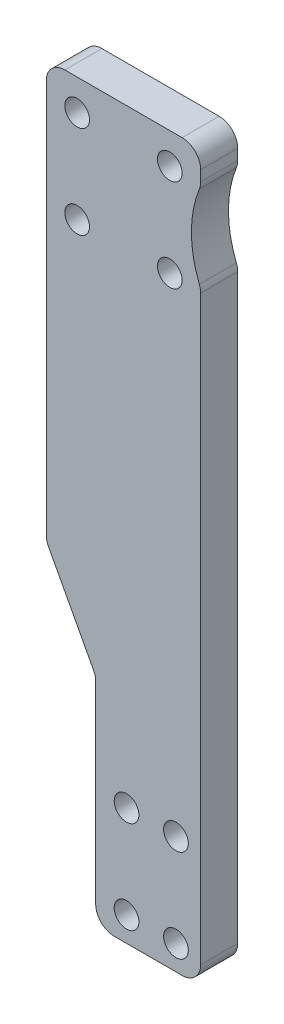
ISO-10303-21;
HEADER;
FILE_DESCRIPTION(('STEP AP214'),'2;1');
FILE_NAME('part.step','',(''),(''),'','','');
FILE_SCHEMA(('AUTOMOTIVE_DESIGN { 1 0 10303 214 1 1 1 1 }'));
ENDSEC;
DATA;
#1=APPLICATION_CONTEXT('core data for automotive mechanical design processes');
#2=APPLICATION_PROTOCOL_DEFINITION('international standard','automotive_design',2000,#1);
#3=PRODUCT_CONTEXT('',#1,'mechanical');
#4=PRODUCT('Part','Part','',(#3));
#5=PRODUCT_RELATED_PRODUCT_CATEGORY('part','',(#4));
#6=PRODUCT_DEFINITION_FORMATION('','',#4);
#7=PRODUCT_DEFINITION_CONTEXT('part definition',#1,'design');
#8=PRODUCT_DEFINITION('design','',#6,#7);
#9=PRODUCT_DEFINITION_SHAPE('','',#8);
#10=(LENGTH_UNIT() NAMED_UNIT(*) SI_UNIT(.MILLI.,.METRE.));
#11=(NAMED_UNIT(*) PLANE_ANGLE_UNIT() SI_UNIT($,.RADIAN.));
#12=(NAMED_UNIT(*) SI_UNIT($,.STERADIAN.) SOLID_ANGLE_UNIT());
#13=UNCERTAINTY_MEASURE_WITH_UNIT(LENGTH_MEASURE(1.E-05),#10,'distance_accuracy_value','');
#14=(GEOMETRIC_REPRESENTATION_CONTEXT(3) GLOBAL_UNCERTAINTY_ASSIGNED_CONTEXT((#13)) GLOBAL_UNIT_ASSIGNED_CONTEXT((#10,
#11,#12)) REPRESENTATION_CONTEXT('',''));
#15=CARTESIAN_POINT('',(0.,0.,0.));
#16=DIRECTION('',(0.,0.,1.));
#17=DIRECTION('',(1.,0.,0.));
#18=AXIS2_PLACEMENT_3D('',#15,#16,#17);
#19=CARTESIAN_POINT('',(0.,0.,6.));
#20=DIRECTION('',(0.,0.,1.));
#21=DIRECTION('',(1.,0.,0.));
#22=AXIS2_PLACEMENT_3D('',#19,#20,#21);
#23=PLANE('',#22);
#24=DIRECTION('',(0.,1.,0.));
#25=VECTOR('',#24,1.);
#26=CARTESIAN_POINT('',(0.999999999999982,30.,6.));
#27=LINE('',#26,#25);
#28=CARTESIAN_POINT('',(0.999999999999986,-1.99999999999999,6.));
#29=VERTEX_POINT('',#28);
#30=CARTESIAN_POINT('',(0.999999999999982,29.25,6.));
#31=VERTEX_POINT('',#30);
#32=EDGE_CURVE('E484',#29,#31,#27,.T.);
#33=ORIENTED_EDGE('',*,*,#32,.F.);
#34=CARTESIAN_POINT('',(3.99999999999999,-1.99999999999999,6.));
#35=DIRECTION('',(0.,0.,1.));
#36=DIRECTION('',(1.,0.,0.));
#37=AXIS2_PLACEMENT_3D('',#34,#35,#36);
#38=CIRCLE('',#37,3.);
#39=CARTESIAN_POINT('',(3.99999999999999,-5.,6.));
#40=VERTEX_POINT('',#39);
#41=EDGE_CURVE('E298',#29,#40,#38,.T.);
#42=ORIENTED_EDGE('',*,*,#41,.T.);
#43=DIRECTION('',(1.,0.,0.));
#44=VECTOR('',#43,1.);
#45=CARTESIAN_POINT('',(0.,-5.,6.));
#46=LINE('',#45,#44);
#47=CARTESIAN_POINT('',(15.,-5.,6.));
#48=VERTEX_POINT('',#47);
#49=EDGE_CURVE('E244',#40,#48,#46,.T.);
#50=ORIENTED_EDGE('',*,*,#49,.T.);
#51=CARTESIAN_POINT('',(15.,-2.,6.));
#52=DIRECTION('',(0.,0.,1.));
#53=DIRECTION('',(1.,0.,0.));
#54=AXIS2_PLACEMENT_3D('',#51,#52,#53);
#55=CIRCLE('',#54,3.);
#56=CARTESIAN_POINT('',(18.,-1.99999999999999,6.));
#57=VERTEX_POINT('',#56);
#58=EDGE_CURVE('E258',#48,#57,#55,.T.);
#59=ORIENTED_EDGE('',*,*,#58,.T.);
#60=DIRECTION('',(0.,-1.,0.));
#61=VECTOR('',#60,1.);
#62=CARTESIAN_POINT('',(18.,0.,6.));
#63=LINE('',#62,#61);
#64=CARTESIAN_POINT('',(18.,92.20577136594,6.));
#65=VERTEX_POINT('',#64);
#66=EDGE_CURVE('E235',#65,#57,#63,.T.);
#67=ORIENTED_EDGE('',*,*,#66,.F.);
#68=CARTESIAN_POINT('',(15.,92.20577136594,6.));
#69=DIRECTION('',(0.,0.,1.));
#70=DIRECTION('',(1.,0.,0.));
#71=AXIS2_PLACEMENT_3D('',#68,#69,#70);
#72=CIRCLE('',#71,3.);
#73=CARTESIAN_POINT('',(17.7857142857143,93.3192325993771,6.));
#74=VERTEX_POINT('',#73);
#75=EDGE_CURVE('E260',#65,#74,#72,.T.);
#76=ORIENTED_EDGE('',*,*,#75,.T.);
#77=CARTESIAN_POINT('',(34.5,100.,6.));
#78=DIRECTION('',(0.,0.,1.));
#79=DIRECTION('',(1.,0.,0.));
#80=AXIS2_PLACEMENT_3D('',#77,#78,#79);
#81=CIRCLE('',#80,18.);
#82=CARTESIAN_POINT('',(17.7857142857143,106.680767400623,6.));
#83=VERTEX_POINT('',#82);
#84=EDGE_CURVE('E458',#83,#74,#81,.T.);
#85=ORIENTED_EDGE('',*,*,#84,.F.);
#86=CARTESIAN_POINT('',(15.,107.79422863406,6.));
#87=DIRECTION('',(0.,0.,1.));
#88=DIRECTION('',(1.,0.,0.));
#89=AXIS2_PLACEMENT_3D('',#86,#87,#88);
#90=CIRCLE('',#89,3.);
#91=CARTESIAN_POINT('',(18.,107.79422863406,6.));
#92=VERTEX_POINT('',#91);
#93=EDGE_CURVE('E262',#83,#92,#90,.T.);
#94=ORIENTED_EDGE('',*,*,#93,.T.);
#95=CARTESIAN_POINT('',(18.,109.5,6.));
#96=VERTEX_POINT('',#95);
#97=EDGE_CURVE('E441',#96,#92,#63,.T.);
#98=ORIENTED_EDGE('',*,*,#97,.F.);
#99=CARTESIAN_POINT('',(15.,109.5,6.));
#100=DIRECTION('',(0.,0.,1.));
#101=DIRECTION('',(1.,0.,0.));
#102=AXIS2_PLACEMENT_3D('',#99,#100,#101);
#103=CIRCLE('',#102,3.);
#104=CARTESIAN_POINT('',(15.,112.5,6.));
#105=VERTEX_POINT('',#104);
#106=EDGE_CURVE('E256',#96,#105,#103,.T.);
#107=ORIENTED_EDGE('',*,*,#106,.T.);
#108=DIRECTION('',(1.,0.,0.));
#109=VECTOR('',#108,1.);
#110=CARTESIAN_POINT('',(0.,112.5,6.));
#111=LINE('',#110,#109);
#112=CARTESIAN_POINT('',(-4.00000000000001,112.5,6.));
#113=VERTEX_POINT('',#112);
#114=EDGE_CURVE('E435',#113,#105,#111,.T.);
#115=ORIENTED_EDGE('',*,*,#114,.F.);
#116=CARTESIAN_POINT('',(-4.00000000000001,109.5,6.));
#117=DIRECTION('',(0.,0.,1.));
#118=DIRECTION('',(1.,0.,0.));
#119=AXIS2_PLACEMENT_3D('',#116,#117,#118);
#120=CIRCLE('',#119,3.);
#121=CARTESIAN_POINT('',(-7.00000000000001,109.5,6.));
#122=VERTEX_POINT('',#121);
#123=EDGE_CURVE('E264',#113,#122,#120,.T.);
#124=ORIENTED_EDGE('',*,*,#123,.T.);
#125=DIRECTION('',(0.,-1.,0.));
#126=VECTOR('',#125,1.);
#127=CARTESIAN_POINT('',(-7.,0.,6.));
#128=LINE('',#127,#126);
#129=CARTESIAN_POINT('',(-7.,45.75,6.));
#130=VERTEX_POINT('',#129);
#131=EDGE_CURVE('E216',#122,#130,#128,.T.);
#132=ORIENTED_EDGE('',*,*,#131,.T.);
#133=CARTESIAN_POINT('',(-4.,45.75,6.));
#134=DIRECTION('',(0.,0.,1.));
#135=DIRECTION('',(1.,0.,0.));
#136=AXIS2_PLACEMENT_3D('',#133,#134,#135);
#137=CIRCLE('',#136,3.);
#138=CARTESIAN_POINT('',(-6.64705882352942,44.3382352941176,6.));
#139=VERTEX_POINT('',#138);
#140=EDGE_CURVE('E296',#130,#139,#137,.T.);
#141=ORIENTED_EDGE('',*,*,#140,.T.);
#142=DIRECTION('',(-0.470588235294117,0.882352941176471,0.));
#143=VECTOR('',#142,1.);
#144=CARTESIAN_POINT('',(-7.00000000000001,45.,6.));
#145=LINE('',#144,#143);
#146=CARTESIAN_POINT('',(0.647058823529396,30.6617647058824,6.));
#147=VERTEX_POINT('',#146);
#148=EDGE_CURVE('E492',#147,#139,#145,.T.);
#149=ORIENTED_EDGE('',*,*,#148,.F.);
#150=CARTESIAN_POINT('',(-2.00000000000002,29.25,6.));
#151=DIRECTION('',(0.,0.,1.));
#152=DIRECTION('',(1.,0.,0.));
#153=AXIS2_PLACEMENT_3D('',#150,#151,#152);
#154=CIRCLE('',#153,3.);
#155=EDGE_CURVE('E311',#147,#31,#154,.F.);
#156=ORIENTED_EDGE('',*,*,#155,.T.);
#157=EDGE_LOOP('',(#33,#42,#50,#59,#67,#76,#85,#94,#98,#107,#115,#124,#132,#141,#149,#156));
#158=FACE_BOUND('',#157,.T.);
#159=CARTESIAN_POINT('',(14.,14.,6.));
#160=DIRECTION('',(0.,0.,1.));
#161=DIRECTION('',(1.,0.,0.));
#162=AXIS2_PLACEMENT_3D('',#159,#160,#161);
#163=CIRCLE('',#162,2.);
#164=CARTESIAN_POINT('',(16.,14.,6.));
#165=VERTEX_POINT('',#164);
#166=EDGE_CURVE('E288',#165,#165,#163,.T.);
#167=ORIENTED_EDGE('',*,*,#166,.F.);
#168=EDGE_LOOP('',(#167));
#169=FACE_BOUND('',#168,.T.);
#170=CARTESIAN_POINT('',(14.,-0.999999999999995,6.));
#171=DIRECTION('',(0.,0.,1.));
#172=DIRECTION('',(1.,0.,0.));
#173=AXIS2_PLACEMENT_3D('',#170,#171,#172);
#174=CIRCLE('',#173,2.);
#175=CARTESIAN_POINT('',(16.,-0.999999999999995,6.));
#176=VERTEX_POINT('',#175);
#177=EDGE_CURVE('E490',#176,#176,#174,.T.);
#178=ORIENTED_EDGE('',*,*,#177,.F.);
#179=EDGE_LOOP('',(#178));
#180=FACE_BOUND('',#179,.T.);
#181=CARTESIAN_POINT('',(5.99999999999999,14.,6.));
#182=DIRECTION('',(0.,0.,1.));
#183=DIRECTION('',(1.,0.,0.));
#184=AXIS2_PLACEMENT_3D('',#181,#182,#183);
#185=CIRCLE('',#184,2.);
#186=CARTESIAN_POINT('',(7.99999999999999,14.,6.));
#187=VERTEX_POINT('',#186);
#188=EDGE_CURVE('E291',#187,#187,#185,.T.);
#189=ORIENTED_EDGE('',*,*,#188,.F.);
#190=EDGE_LOOP('',(#189));
#191=FACE_BOUND('',#190,.T.);
#192=CARTESIAN_POINT('',(5.99999999999999,-0.999999999999996,6.));
#193=DIRECTION('',(0.,0.,1.));
#194=DIRECTION('',(1.,0.,0.));
#195=AXIS2_PLACEMENT_3D('',#192,#193,#194);
#196=CIRCLE('',#195,2.);
#197=CARTESIAN_POINT('',(7.99999999999999,-0.999999999999996,6.));
#198=VERTEX_POINT('',#197);
#199=EDGE_CURVE('E242',#198,#198,#196,.T.);
#200=ORIENTED_EDGE('',*,*,#199,.F.);
#201=EDGE_LOOP('',(#200));
#202=FACE_BOUND('',#201,.T.);
#203=CARTESIAN_POINT('',(13.,107.5,6.));
#204=DIRECTION('',(0.,0.,1.));
#205=DIRECTION('',(1.,0.,0.));
#206=AXIS2_PLACEMENT_3D('',#203,#204,#205);
#207=CIRCLE('',#206,2.00000000000001);
#208=CARTESIAN_POINT('',(15.,107.5,6.));
#209=VERTEX_POINT('',#208);
#210=EDGE_CURVE('E434',#209,#209,#207,.T.);
#211=ORIENTED_EDGE('',*,*,#210,.F.);
#212=EDGE_LOOP('',(#211));
#213=FACE_BOUND('',#212,.T.);
#214=CARTESIAN_POINT('',(13.,92.5,6.));
#215=DIRECTION('',(0.,0.,1.));
#216=DIRECTION('',(1.,0.,0.));
#217=AXIS2_PLACEMENT_3D('',#214,#215,#216);
#218=CIRCLE('',#217,2.00000000000001);
#219=CARTESIAN_POINT('',(15.,92.5,6.));
#220=VERTEX_POINT('',#219);
#221=EDGE_CURVE('E438',#220,#220,#218,.T.);
#222=ORIENTED_EDGE('',*,*,#221,.F.);
#223=EDGE_LOOP('',(#222));
#224=FACE_BOUND('',#223,.T.);
#225=CARTESIAN_POINT('',(-2.00000000000001,92.5,6.));
#226=DIRECTION('',(0.,0.,1.));
#227=DIRECTION('',(1.,0.,0.));
#228=AXIS2_PLACEMENT_3D('',#225,#226,#227);
#229=CIRCLE('',#228,2.00000000000001);
#230=CARTESIAN_POINT('',(0.,92.5,6.));
#231=VERTEX_POINT('',#230);
#232=EDGE_CURVE('E447',#231,#231,#229,.T.);
#233=ORIENTED_EDGE('',*,*,#232,.F.);
#234=EDGE_LOOP('',(#233));
#235=FACE_BOUND('',#234,.T.);
#236=CARTESIAN_POINT('',(-2.00000000000001,107.5,6.));
#237=DIRECTION('',(0.,0.,1.));
#238=DIRECTION('',(1.,0.,0.));
#239=AXIS2_PLACEMENT_3D('',#236,#237,#238);
#240=CIRCLE('',#239,2.00000000000001);
#241=CARTESIAN_POINT('',(0.,107.5,6.));
#242=VERTEX_POINT('',#241);
#243=EDGE_CURVE('E237',#242,#242,#240,.T.);
#244=ORIENTED_EDGE('',*,*,#243,.F.);
#245=EDGE_LOOP('',(#244));
#246=FACE_BOUND('',#245,.T.);
#247=ADVANCED_FACE('F81',(#158,#169,#180,#191,#202,#213,#224,#235,#246),#23,.T.);
#248=CARTESIAN_POINT('',(0.,0.,0.));
#249=DIRECTION('',(0.,0.,1.));
#250=DIRECTION('',(1.,0.,0.));
#251=AXIS2_PLACEMENT_3D('',#248,#249,#250);
#252=PLANE('',#251);
#253=CARTESIAN_POINT('',(-2.00000000000001,92.5,0.));
#254=DIRECTION('',(0.,0.,1.));
#255=DIRECTION('',(1.,0.,0.));
#256=AXIS2_PLACEMENT_3D('',#253,#254,#255);
#257=CIRCLE('',#256,3.99999999999999);
#258=CARTESIAN_POINT('',(1.99999999999998,92.5,0.));
#259=VERTEX_POINT('',#258);
#260=EDGE_CURVE('E318',#259,#259,#257,.T.);
#261=ORIENTED_EDGE('',*,*,#260,.T.);
#262=EDGE_LOOP('',(#261));
#263=FACE_BOUND('',#262,.T.);
#264=CARTESIAN_POINT('',(-2.00000000000001,107.5,0.));
#265=DIRECTION('',(0.,0.,1.));
#266=DIRECTION('',(1.,0.,0.));
#267=AXIS2_PLACEMENT_3D('',#264,#265,#266);
#268=CIRCLE('',#267,3.99999999999999);
#269=CARTESIAN_POINT('',(1.99999999999998,107.5,0.));
#270=VERTEX_POINT('',#269);
#271=EDGE_CURVE('E315',#270,#270,#268,.T.);
#272=ORIENTED_EDGE('',*,*,#271,.T.);
#273=EDGE_LOOP('',(#272));
#274=FACE_BOUND('',#273,.T.);
#275=CARTESIAN_POINT('',(14.,14.,0.));
#276=DIRECTION('',(0.,0.,1.));
#277=DIRECTION('',(1.,0.,0.));
#278=AXIS2_PLACEMENT_3D('',#275,#276,#277);
#279=CIRCLE('',#278,2.);
#280=CARTESIAN_POINT('',(16.,14.,0.));
#281=VERTEX_POINT('',#280);
#282=EDGE_CURVE('E287',#281,#281,#279,.T.);
#283=ORIENTED_EDGE('',*,*,#282,.T.);
#284=EDGE_LOOP('',(#283));
#285=FACE_BOUND('',#284,.T.);
#286=CARTESIAN_POINT('',(14.,-0.999999999999995,0.));
#287=DIRECTION('',(0.,0.,1.));
#288=DIRECTION('',(1.,0.,0.));
#289=AXIS2_PLACEMENT_3D('',#286,#287,#288);
#290=CIRCLE('',#289,2.);
#291=CARTESIAN_POINT('',(16.,-0.999999999999995,0.));
#292=VERTEX_POINT('',#291);
#293=EDGE_CURVE('E284',#292,#292,#290,.T.);
#294=ORIENTED_EDGE('',*,*,#293,.T.);
#295=EDGE_LOOP('',(#294));
#296=FACE_BOUND('',#295,.T.);
#297=CARTESIAN_POINT('',(5.99999999999999,14.,0.));
#298=DIRECTION('',(0.,0.,1.));
#299=DIRECTION('',(1.,0.,0.));
#300=AXIS2_PLACEMENT_3D('',#297,#298,#299);
#301=CIRCLE('',#300,2.);
#302=CARTESIAN_POINT('',(7.99999999999999,14.,0.));
#303=VERTEX_POINT('',#302);
#304=EDGE_CURVE('E241',#303,#303,#301,.T.);
#305=ORIENTED_EDGE('',*,*,#304,.T.);
#306=EDGE_LOOP('',(#305));
#307=FACE_BOUND('',#306,.T.);
#308=CARTESIAN_POINT('',(5.99999999999999,-0.999999999999996,0.));
#309=DIRECTION('',(0.,0.,1.));
#310=DIRECTION('',(1.,0.,0.));
#311=AXIS2_PLACEMENT_3D('',#308,#309,#310);
#312=CIRCLE('',#311,2.);
#313=CARTESIAN_POINT('',(7.99999999999999,-0.999999999999996,0.));
#314=VERTEX_POINT('',#313);
#315=EDGE_CURVE('E238',#314,#314,#312,.T.);
#316=ORIENTED_EDGE('',*,*,#315,.T.);
#317=EDGE_LOOP('',(#316));
#318=FACE_BOUND('',#317,.T.);
#319=DIRECTION('',(1.,0.,0.));
#320=VECTOR('',#319,1.);
#321=CARTESIAN_POINT('',(0.,-5.,0.));
#322=LINE('',#321,#320);
#323=CARTESIAN_POINT('',(3.99999999999999,-5.,0.));
#324=VERTEX_POINT('',#323);
#325=CARTESIAN_POINT('',(15.,-5.,0.));
#326=VERTEX_POINT('',#325);
#327=EDGE_CURVE('E218',#324,#326,#322,.T.);
#328=ORIENTED_EDGE('',*,*,#327,.F.);
#329=CARTESIAN_POINT('',(3.99999999999999,-1.99999999999999,0.));
#330=DIRECTION('',(0.,0.,1.));
#331=DIRECTION('',(1.,0.,0.));
#332=AXIS2_PLACEMENT_3D('',#329,#330,#331);
#333=CIRCLE('',#332,3.);
#334=CARTESIAN_POINT('',(0.999999999999986,-2.,0.));
#335=VERTEX_POINT('',#334);
#336=EDGE_CURVE('E303',#324,#335,#333,.F.);
#337=ORIENTED_EDGE('',*,*,#336,.T.);
#338=DIRECTION('',(0.,1.,0.));
#339=VECTOR('',#338,1.);
#340=CARTESIAN_POINT('',(0.999999999999985,0.,0.));
#341=LINE('',#340,#339);
#342=CARTESIAN_POINT('',(0.999999999999982,29.25,0.));
#343=VERTEX_POINT('',#342);
#344=EDGE_CURVE('E486',#335,#343,#341,.T.);
#345=ORIENTED_EDGE('',*,*,#344,.T.);
#346=CARTESIAN_POINT('',(-2.00000000000002,29.25,0.));
#347=DIRECTION('',(0.,0.,1.));
#348=DIRECTION('',(1.,0.,0.));
#349=AXIS2_PLACEMENT_3D('',#346,#347,#348);
#350=CIRCLE('',#349,3.);
#351=CARTESIAN_POINT('',(0.647058823529395,30.6617647058824,0.));
#352=VERTEX_POINT('',#351);
#353=EDGE_CURVE('E313',#343,#352,#350,.T.);
#354=ORIENTED_EDGE('',*,*,#353,.T.);
#355=DIRECTION('',(-0.470588235294117,0.882352941176471,0.));
#356=VECTOR('',#355,1.);
#357=CARTESIAN_POINT('',(13.235294117647,7.05882352941175,0.));
#358=LINE('',#357,#356);
#359=CARTESIAN_POINT('',(-6.64705882352942,44.3382352941176,0.));
#360=VERTEX_POINT('',#359);
#361=EDGE_CURVE('E488',#352,#360,#358,.T.);
#362=ORIENTED_EDGE('',*,*,#361,.T.);
#363=CARTESIAN_POINT('',(-4.,45.75,0.));
#364=DIRECTION('',(0.,0.,1.));
#365=DIRECTION('',(1.,0.,0.));
#366=AXIS2_PLACEMENT_3D('',#363,#364,#365);
#367=CIRCLE('',#366,3.);
#368=CARTESIAN_POINT('',(-7.,45.75,0.));
#369=VERTEX_POINT('',#368);
#370=EDGE_CURVE('E97',#360,#369,#367,.F.);
#371=ORIENTED_EDGE('',*,*,#370,.T.);
#372=DIRECTION('',(0.,-1.,0.));
#373=VECTOR('',#372,1.);
#374=CARTESIAN_POINT('',(-7.,0.,0.));
#375=LINE('',#374,#373);
#376=CARTESIAN_POINT('',(-7.00000000000001,109.5,0.));
#377=VERTEX_POINT('',#376);
#378=EDGE_CURVE('E213',#377,#369,#375,.T.);
#379=ORIENTED_EDGE('',*,*,#378,.F.);
#380=CARTESIAN_POINT('',(-4.00000000000001,109.5,0.));
#381=DIRECTION('',(0.,0.,1.));
#382=DIRECTION('',(1.,0.,0.));
#383=AXIS2_PLACEMENT_3D('',#380,#381,#382);
#384=CIRCLE('',#383,3.);
#385=CARTESIAN_POINT('',(-4.00000000000001,112.5,0.));
#386=VERTEX_POINT('',#385);
#387=EDGE_CURVE('E198',#377,#386,#384,.F.);
#388=ORIENTED_EDGE('',*,*,#387,.T.);
#389=DIRECTION('',(1.,0.,0.));
#390=VECTOR('',#389,1.);
#391=CARTESIAN_POINT('',(0.,112.5,0.));
#392=LINE('',#391,#390);
#393=CARTESIAN_POINT('',(15.,112.5,0.));
#394=VERTEX_POINT('',#393);
#395=EDGE_CURVE('E224',#386,#394,#392,.T.);
#396=ORIENTED_EDGE('',*,*,#395,.T.);
#397=CARTESIAN_POINT('',(15.,109.5,0.));
#398=DIRECTION('',(0.,0.,1.));
#399=DIRECTION('',(1.,0.,0.));
#400=AXIS2_PLACEMENT_3D('',#397,#398,#399);
#401=CIRCLE('',#400,3.);
#402=CARTESIAN_POINT('',(18.,109.5,0.));
#403=VERTEX_POINT('',#402);
#404=EDGE_CURVE('E217',#394,#403,#401,.F.);
#405=ORIENTED_EDGE('',*,*,#404,.T.);
#406=DIRECTION('',(0.,-1.,0.));
#407=VECTOR('',#406,1.);
#408=CARTESIAN_POINT('',(18.,0.,0.));
#409=LINE('',#408,#407);
#410=CARTESIAN_POINT('',(18.,107.79422863406,0.));
#411=VERTEX_POINT('',#410);
#412=EDGE_CURVE('E229',#403,#411,#409,.T.);
#413=ORIENTED_EDGE('',*,*,#412,.T.);
#414=CARTESIAN_POINT('',(15.,107.79422863406,0.));
#415=DIRECTION('',(0.,0.,1.));
#416=DIRECTION('',(1.,0.,0.));
#417=AXIS2_PLACEMENT_3D('',#414,#415,#416);
#418=CIRCLE('',#417,3.);
#419=CARTESIAN_POINT('',(17.7857142857143,106.680767400623,0.));
#420=VERTEX_POINT('',#419);
#421=EDGE_CURVE('E207',#411,#420,#418,.F.);
#422=ORIENTED_EDGE('',*,*,#421,.T.);
#423=CARTESIAN_POINT('',(34.5,100.,0.));
#424=DIRECTION('',(0.,0.,1.));
#425=DIRECTION('',(1.,0.,0.));
#426=AXIS2_PLACEMENT_3D('',#423,#424,#425);
#427=CIRCLE('',#426,18.);
#428=CARTESIAN_POINT('',(17.7857142857143,93.3192325993771,0.));
#429=VERTEX_POINT('',#428);
#430=EDGE_CURVE('E453',#420,#429,#427,.T.);
#431=ORIENTED_EDGE('',*,*,#430,.T.);
#432=CARTESIAN_POINT('',(15.,92.20577136594,0.));
#433=DIRECTION('',(0.,0.,1.));
#434=DIRECTION('',(1.,0.,0.));
#435=AXIS2_PLACEMENT_3D('',#432,#433,#434);
#436=CIRCLE('',#435,3.);
#437=CARTESIAN_POINT('',(18.,92.20577136594,0.));
#438=VERTEX_POINT('',#437);
#439=EDGE_CURVE('E250',#429,#438,#436,.F.);
#440=ORIENTED_EDGE('',*,*,#439,.T.);
#441=CARTESIAN_POINT('',(18.,-1.99999999999999,0.));
#442=VERTEX_POINT('',#441);
#443=EDGE_CURVE('E451',#438,#442,#409,.T.);
#444=ORIENTED_EDGE('',*,*,#443,.T.);
#445=CARTESIAN_POINT('',(15.,-2.,0.));
#446=DIRECTION('',(0.,0.,1.));
#447=DIRECTION('',(1.,0.,0.));
#448=AXIS2_PLACEMENT_3D('',#445,#446,#447);
#449=CIRCLE('',#448,3.);
#450=EDGE_CURVE('E247',#442,#326,#449,.F.);
#451=ORIENTED_EDGE('',*,*,#450,.T.);
#452=EDGE_LOOP('',(#328,#337,#345,#354,#362,#371,#379,#388,#396,#405,#413,#422,#431,#440,#444,#451));
#453=FACE_BOUND('',#452,.T.);
#454=CARTESIAN_POINT('',(13.,107.5,0.));
#455=DIRECTION('',(0.,0.,1.));
#456=DIRECTION('',(1.,0.,0.));
#457=AXIS2_PLACEMENT_3D('',#454,#455,#456);
#458=CIRCLE('',#457,2.00000000000001);
#459=CARTESIAN_POINT('',(15.,107.5,0.));
#460=VERTEX_POINT('',#459);
#461=EDGE_CURVE('E223',#460,#460,#458,.T.);
#462=ORIENTED_EDGE('',*,*,#461,.T.);
#463=EDGE_LOOP('',(#462));
#464=FACE_BOUND('',#463,.T.);
#465=CARTESIAN_POINT('',(13.,92.5,0.));
#466=DIRECTION('',(0.,0.,1.));
#467=DIRECTION('',(1.,0.,0.));
#468=AXIS2_PLACEMENT_3D('',#465,#466,#467);
#469=CIRCLE('',#468,2.00000000000001);
#470=CARTESIAN_POINT('',(15.,92.5,0.));
#471=VERTEX_POINT('',#470);
#472=EDGE_CURVE('E227',#471,#471,#469,.T.);
#473=ORIENTED_EDGE('',*,*,#472,.T.);
#474=EDGE_LOOP('',(#473));
#475=FACE_BOUND('',#474,.T.);
#476=ADVANCED_FACE('F221',(#263,#274,#285,#296,#307,#318,#453,#464,#475),#252,.F.);
#477=CARTESIAN_POINT('',(18.,0.,6.));
#478=DIRECTION('',(1.,0.,0.));
#479=DIRECTION('',(0.,1.,0.));
#480=AXIS2_PLACEMENT_3D('',#477,#478,#479);
#481=PLANE('',#480);
#482=ORIENTED_EDGE('',*,*,#97,.T.);
#483=DIRECTION('',(0.,0.,-1.));
#484=VECTOR('',#483,1.);
#485=CARTESIAN_POINT('',(18.,107.79422863406,0.));
#486=LINE('',#485,#484);
#487=EDGE_CURVE('E274',#92,#411,#486,.T.);
#488=ORIENTED_EDGE('',*,*,#487,.T.);
#489=ORIENTED_EDGE('',*,*,#412,.F.);
#490=DIRECTION('',(0.,0.,-1.));
#491=VECTOR('',#490,1.);
#492=CARTESIAN_POINT('',(18.,109.5,6.));
#493=LINE('',#492,#491);
#494=EDGE_CURVE('E272',#403,#96,#493,.F.);
#495=ORIENTED_EDGE('',*,*,#494,.T.);
#496=EDGE_LOOP('',(#482,#488,#489,#495));
#497=FACE_BOUND('',#496,.T.);
#498=ADVANCED_FACE('F334',(#497),#481,.T.);
#499=ORIENTED_EDGE('',*,*,#443,.F.);
#500=DIRECTION('',(0.,0.,-1.));
#501=VECTOR('',#500,1.);
#502=CARTESIAN_POINT('',(18.,92.20577136594,6.));
#503=LINE('',#502,#501);
#504=EDGE_CURVE('E278',#438,#65,#503,.F.);
#505=ORIENTED_EDGE('',*,*,#504,.T.);
#506=ORIENTED_EDGE('',*,*,#66,.T.);
#507=DIRECTION('',(0.,0.,1.));
#508=VECTOR('',#507,1.);
#509=CARTESIAN_POINT('',(18.,-1.99999999999999,6.));
#510=LINE('',#509,#508);
#511=EDGE_CURVE('E276',#57,#442,#510,.F.);
#512=ORIENTED_EDGE('',*,*,#511,.T.);
#513=EDGE_LOOP('',(#499,#505,#506,#512));
#514=FACE_BOUND('',#513,.T.);
#515=ADVANCED_FACE('F390',(#514),#481,.T.);
#516=CARTESIAN_POINT('',(0.,112.5,6.));
#517=DIRECTION('',(0.,1.,0.));
#518=DIRECTION('',(-1.,0.,0.));
#519=AXIS2_PLACEMENT_3D('',#516,#517,#518);
#520=PLANE('',#519);
#521=ORIENTED_EDGE('',*,*,#395,.F.);
#522=DIRECTION('',(0.,0.,-1.));
#523=VECTOR('',#522,1.);
#524=CARTESIAN_POINT('',(-4.00000000000001,112.5,6.));
#525=LINE('',#524,#523);
#526=EDGE_CURVE('E203',#386,#113,#525,.F.);
#527=ORIENTED_EDGE('',*,*,#526,.T.);
#528=ORIENTED_EDGE('',*,*,#114,.T.);
#529=DIRECTION('',(0.,0.,-1.));
#530=VECTOR('',#529,1.);
#531=CARTESIAN_POINT('',(15.,112.5,6.));
#532=LINE('',#531,#530);
#533=EDGE_CURVE('E206',#105,#394,#532,.T.);
#534=ORIENTED_EDGE('',*,*,#533,.T.);
#535=EDGE_LOOP('',(#521,#527,#528,#534));
#536=FACE_BOUND('',#535,.T.);
#537=ADVANCED_FACE('F387',(#536),#520,.T.);
#538=CARTESIAN_POINT('',(-7.,0.,6.));
#539=DIRECTION('',(1.,0.,0.));
#540=DIRECTION('',(0.,1.,0.));
#541=AXIS2_PLACEMENT_3D('',#538,#539,#540);
#542=PLANE('',#541);
#543=ORIENTED_EDGE('',*,*,#378,.T.);
#544=DIRECTION('',(0.,0.,1.));
#545=VECTOR('',#544,1.);
#546=CARTESIAN_POINT('',(-7.,45.75,6.));
#547=LINE('',#546,#545);
#548=EDGE_CURVE('E309',#369,#130,#547,.T.);
#549=ORIENTED_EDGE('',*,*,#548,.T.);
#550=ORIENTED_EDGE('',*,*,#131,.F.);
#551=DIRECTION('',(0.,0.,-1.));
#552=VECTOR('',#551,1.);
#553=CARTESIAN_POINT('',(-7.00000000000001,109.5,0.));
#554=LINE('',#553,#552);
#555=EDGE_CURVE('E202',#122,#377,#554,.T.);
#556=ORIENTED_EDGE('',*,*,#555,.T.);
#557=EDGE_LOOP('',(#543,#549,#550,#556));
#558=FACE_BOUND('',#557,.T.);
#559=ADVANCED_FACE('F211',(#558),#542,.F.);
#560=CARTESIAN_POINT('',(-2.00000000000001,107.5,6.));
#561=DIRECTION('',(0.,0.,-1.));
#562=DIRECTION('',(-1.,0.,0.));
#563=AXIS2_PLACEMENT_3D('',#560,#561,#562);
#564=CYLINDRICAL_SURFACE('',#563,2.00000000000001);
#565=CARTESIAN_POINT('',(-2.00000000000001,107.5,2.00000000000001));
#566=DIRECTION('',(0.,0.,1.));
#567=DIRECTION('',(1.,0.,0.));
#568=AXIS2_PLACEMENT_3D('',#565,#566,#567);
#569=CIRCLE('',#568,2.00000000000001);
#570=CARTESIAN_POINT('',(0.,107.5,2.00000000000001));
#571=VERTEX_POINT('',#570);
#572=EDGE_CURVE('E12',#571,#571,#569,.F.);
#573=ORIENTED_EDGE('',*,*,#572,.T.);
#574=EDGE_LOOP('',(#573));
#575=FACE_BOUND('',#574,.T.);
#576=ORIENTED_EDGE('',*,*,#243,.T.);
#577=EDGE_LOOP('',(#576));
#578=FACE_BOUND('',#577,.T.);
#579=ADVANCED_FACE('F371',(#575,#578),#564,.F.);
#580=CARTESIAN_POINT('',(-2.00000000000001,92.5,6.));
#581=DIRECTION('',(0.,0.,-1.));
#582=DIRECTION('',(-1.,0.,0.));
#583=AXIS2_PLACEMENT_3D('',#580,#581,#582);
#584=CYLINDRICAL_SURFACE('',#583,2.00000000000001);
#585=CARTESIAN_POINT('',(-2.00000000000001,92.5,2.00000000000001));
#586=DIRECTION('',(0.,0.,1.));
#587=DIRECTION('',(1.,0.,0.));
#588=AXIS2_PLACEMENT_3D('',#585,#586,#587);
#589=CIRCLE('',#588,2.00000000000001);
#590=CARTESIAN_POINT('',(0.,92.5,2.00000000000001));
#591=VERTEX_POINT('',#590);
#592=EDGE_CURVE('E90',#591,#591,#589,.F.);
#593=ORIENTED_EDGE('',*,*,#592,.T.);
#594=EDGE_LOOP('',(#593));
#595=FACE_BOUND('',#594,.T.);
#596=ORIENTED_EDGE('',*,*,#232,.T.);
#597=EDGE_LOOP('',(#596));
#598=FACE_BOUND('',#597,.T.);
#599=ADVANCED_FACE('F323',(#595,#598),#584,.F.);
#600=CARTESIAN_POINT('',(13.,92.5,6.));
#601=DIRECTION('',(0.,0.,-1.));
#602=DIRECTION('',(-1.,0.,0.));
#603=AXIS2_PLACEMENT_3D('',#600,#601,#602);
#604=CYLINDRICAL_SURFACE('',#603,2.00000000000001);
#605=ORIENTED_EDGE('',*,*,#221,.T.);
#606=EDGE_LOOP('',(#605));
#607=FACE_BOUND('',#606,.T.);
#608=ORIENTED_EDGE('',*,*,#472,.F.);
#609=EDGE_LOOP('',(#608));
#610=FACE_BOUND('',#609,.T.);
#611=ADVANCED_FACE('F377',(#607,#610),#604,.F.);
#612=CARTESIAN_POINT('',(13.,107.5,6.));
#613=DIRECTION('',(0.,0.,-1.));
#614=DIRECTION('',(-1.,0.,0.));
#615=AXIS2_PLACEMENT_3D('',#612,#613,#614);
#616=CYLINDRICAL_SURFACE('',#615,2.00000000000001);
#617=ORIENTED_EDGE('',*,*,#210,.T.);
#618=EDGE_LOOP('',(#617));
#619=FACE_BOUND('',#618,.T.);
#620=ORIENTED_EDGE('',*,*,#461,.F.);
#621=EDGE_LOOP('',(#620));
#622=FACE_BOUND('',#621,.T.);
#623=ADVANCED_FACE('F380',(#619,#622),#616,.F.);
#624=CARTESIAN_POINT('',(34.5,100.,0.));
#625=DIRECTION('',(0.,0.,1.));
#626=DIRECTION('',(1.,0.,0.));
#627=AXIS2_PLACEMENT_3D('',#624,#625,#626);
#628=CYLINDRICAL_SURFACE('',#627,18.);
#629=ORIENTED_EDGE('',*,*,#430,.F.);
#630=DIRECTION('',(0.,0.,1.));
#631=VECTOR('',#630,1.);
#632=CARTESIAN_POINT('',(17.7857142857143,106.680767400623,0.));
#633=LINE('',#632,#631);
#634=EDGE_CURVE('E269',#420,#83,#633,.T.);
#635=ORIENTED_EDGE('',*,*,#634,.T.);
#636=ORIENTED_EDGE('',*,*,#84,.T.);
#637=DIRECTION('',(0.,0.,1.));
#638=VECTOR('',#637,1.);
#639=CARTESIAN_POINT('',(17.7857142857143,93.3192325993771,0.));
#640=LINE('',#639,#638);
#641=EDGE_CURVE('E266',#74,#429,#640,.F.);
#642=ORIENTED_EDGE('',*,*,#641,.T.);
#643=EDGE_LOOP('',(#629,#635,#636,#642));
#644=FACE_BOUND('',#643,.T.);
#645=ADVANCED_FACE('F358',(#644),#628,.F.);
#646=CARTESIAN_POINT('',(0.,-5.,-4.));
#647=DIRECTION('',(0.,-1.,0.));
#648=DIRECTION('',(0.,0.,-1.));
#649=AXIS2_PLACEMENT_3D('',#646,#647,#648);
#650=PLANE('',#649);
#651=ORIENTED_EDGE('',*,*,#49,.F.);
#652=DIRECTION('',(0.,0.,1.));
#653=VECTOR('',#652,1.);
#654=CARTESIAN_POINT('',(3.99999999999999,-5.,0.));
#655=LINE('',#654,#653);
#656=EDGE_CURVE('E300',#40,#324,#655,.F.);
#657=ORIENTED_EDGE('',*,*,#656,.T.);
#658=ORIENTED_EDGE('',*,*,#327,.T.);
#659=DIRECTION('',(0.,0.,1.));
#660=VECTOR('',#659,1.);
#661=CARTESIAN_POINT('',(15.,-5.,-4.));
#662=LINE('',#661,#660);
#663=EDGE_CURVE('E280',#326,#48,#662,.T.);
#664=ORIENTED_EDGE('',*,*,#663,.T.);
#665=EDGE_LOOP('',(#651,#657,#658,#664));
#666=FACE_BOUND('',#665,.T.);
#667=ADVANCED_FACE('F349',(#666),#650,.T.);
#668=CARTESIAN_POINT('',(5.99999999999999,-0.999999999999996,-4.));
#669=DIRECTION('',(0.,0.,1.));
#670=DIRECTION('',(1.,0.,0.));
#671=AXIS2_PLACEMENT_3D('',#668,#669,#670);
#672=CYLINDRICAL_SURFACE('',#671,2.);
#673=ORIENTED_EDGE('',*,*,#199,.T.);
#674=EDGE_LOOP('',(#673));
#675=FACE_BOUND('',#674,.T.);
#676=ORIENTED_EDGE('',*,*,#315,.F.);
#677=EDGE_LOOP('',(#676));
#678=FACE_BOUND('',#677,.T.);
#679=ADVANCED_FACE('F346',(#675,#678),#672,.F.);
#680=CARTESIAN_POINT('',(5.99999999999999,14.,-4.));
#681=DIRECTION('',(0.,0.,1.));
#682=DIRECTION('',(1.,0.,0.));
#683=AXIS2_PLACEMENT_3D('',#680,#681,#682);
#684=CYLINDRICAL_SURFACE('',#683,2.);
#685=ORIENTED_EDGE('',*,*,#188,.T.);
#686=EDGE_LOOP('',(#685));
#687=FACE_BOUND('',#686,.T.);
#688=ORIENTED_EDGE('',*,*,#304,.F.);
#689=EDGE_LOOP('',(#688));
#690=FACE_BOUND('',#689,.T.);
#691=ADVANCED_FACE('F348',(#687,#690),#684,.F.);
#692=CARTESIAN_POINT('',(-4.00000000000001,109.5,6.));
#693=DIRECTION('',(0.,0.,1.));
#694=DIRECTION('',(1.,0.,0.));
#695=AXIS2_PLACEMENT_3D('',#692,#693,#694);
#696=CYLINDRICAL_SURFACE('',#695,3.);
#697=ORIENTED_EDGE('',*,*,#123,.F.);
#698=ORIENTED_EDGE('',*,*,#526,.F.);
#699=ORIENTED_EDGE('',*,*,#387,.F.);
#700=ORIENTED_EDGE('',*,*,#555,.F.);
#701=EDGE_LOOP('',(#697,#698,#699,#700));
#702=FACE_BOUND('',#701,.T.);
#703=ADVANCED_FACE('F201',(#702),#696,.T.);
#704=CARTESIAN_POINT('',(15.,107.79422863406,0.));
#705=DIRECTION('',(0.,0.,1.));
#706=DIRECTION('',(1.,0.,0.));
#707=AXIS2_PLACEMENT_3D('',#704,#705,#706);
#708=CYLINDRICAL_SURFACE('',#707,3.);
#709=ORIENTED_EDGE('',*,*,#421,.F.);
#710=ORIENTED_EDGE('',*,*,#487,.F.);
#711=ORIENTED_EDGE('',*,*,#93,.F.);
#712=ORIENTED_EDGE('',*,*,#634,.F.);
#713=EDGE_LOOP('',(#709,#710,#711,#712));
#714=FACE_BOUND('',#713,.T.);
#715=ADVANCED_FACE('F397',(#714),#708,.T.);
#716=CARTESIAN_POINT('',(15.,92.20577136594,0.));
#717=DIRECTION('',(0.,0.,1.));
#718=DIRECTION('',(1.,0.,0.));
#719=AXIS2_PLACEMENT_3D('',#716,#717,#718);
#720=CYLINDRICAL_SURFACE('',#719,3.);
#721=ORIENTED_EDGE('',*,*,#75,.F.);
#722=ORIENTED_EDGE('',*,*,#504,.F.);
#723=ORIENTED_EDGE('',*,*,#439,.F.);
#724=ORIENTED_EDGE('',*,*,#641,.F.);
#725=EDGE_LOOP('',(#721,#722,#723,#724));
#726=FACE_BOUND('',#725,.T.);
#727=ADVANCED_FACE('F400',(#726),#720,.T.);
#728=CARTESIAN_POINT('',(15.,-2.,-4.));
#729=DIRECTION('',(0.,0.,1.));
#730=DIRECTION('',(1.,0.,0.));
#731=AXIS2_PLACEMENT_3D('',#728,#729,#730);
#732=CYLINDRICAL_SURFACE('',#731,3.);
#733=ORIENTED_EDGE('',*,*,#450,.F.);
#734=ORIENTED_EDGE('',*,*,#511,.F.);
#735=ORIENTED_EDGE('',*,*,#58,.F.);
#736=ORIENTED_EDGE('',*,*,#663,.F.);
#737=EDGE_LOOP('',(#733,#734,#735,#736));
#738=FACE_BOUND('',#737,.T.);
#739=ADVANCED_FACE('F404',(#738),#732,.T.);
#740=CARTESIAN_POINT('',(15.,109.5,6.));
#741=DIRECTION('',(0.,0.,-1.));
#742=DIRECTION('',(-1.,0.,0.));
#743=AXIS2_PLACEMENT_3D('',#740,#741,#742);
#744=CYLINDRICAL_SURFACE('',#743,3.);
#745=ORIENTED_EDGE('',*,*,#106,.F.);
#746=ORIENTED_EDGE('',*,*,#494,.F.);
#747=ORIENTED_EDGE('',*,*,#404,.F.);
#748=ORIENTED_EDGE('',*,*,#533,.F.);
#749=EDGE_LOOP('',(#745,#746,#747,#748));
#750=FACE_BOUND('',#749,.T.);
#751=ADVANCED_FACE('F408',(#750),#744,.T.);
#752=CARTESIAN_POINT('',(14.,-0.999999999999995,-4.));
#753=DIRECTION('',(0.,0.,1.));
#754=DIRECTION('',(1.,0.,0.));
#755=AXIS2_PLACEMENT_3D('',#752,#753,#754);
#756=CYLINDRICAL_SURFACE('',#755,2.);
#757=ORIENTED_EDGE('',*,*,#177,.T.);
#758=EDGE_LOOP('',(#757));
#759=FACE_BOUND('',#758,.T.);
#760=ORIENTED_EDGE('',*,*,#293,.F.);
#761=EDGE_LOOP('',(#760));
#762=FACE_BOUND('',#761,.T.);
#763=ADVANCED_FACE('F412',(#759,#762),#756,.F.);
#764=CARTESIAN_POINT('',(14.,14.,-4.));
#765=DIRECTION('',(0.,0.,1.));
#766=DIRECTION('',(1.,0.,0.));
#767=AXIS2_PLACEMENT_3D('',#764,#765,#766);
#768=CYLINDRICAL_SURFACE('',#767,2.);
#769=ORIENTED_EDGE('',*,*,#166,.T.);
#770=EDGE_LOOP('',(#769));
#771=FACE_BOUND('',#770,.T.);
#772=ORIENTED_EDGE('',*,*,#282,.F.);
#773=EDGE_LOOP('',(#772));
#774=FACE_BOUND('',#773,.T.);
#775=ADVANCED_FACE('F525',(#771,#774),#768,.F.);
#776=CARTESIAN_POINT('',(0.999999999999982,30.,-4.));
#777=DIRECTION('',(1.,0.,0.));
#778=DIRECTION('',(0.,1.,0.));
#779=AXIS2_PLACEMENT_3D('',#776,#777,#778);
#780=PLANE('',#779);
#781=ORIENTED_EDGE('',*,*,#344,.F.);
#782=DIRECTION('',(0.,0.,1.));
#783=VECTOR('',#782,1.);
#784=CARTESIAN_POINT('',(0.999999999999986,-2.,6.));
#785=LINE('',#784,#783);
#786=EDGE_CURVE('E293',#335,#29,#785,.T.);
#787=ORIENTED_EDGE('',*,*,#786,.T.);
#788=ORIENTED_EDGE('',*,*,#32,.T.);
#789=DIRECTION('',(0.,0.,1.));
#790=VECTOR('',#789,1.);
#791=CARTESIAN_POINT('',(0.999999999999982,29.25,0.));
#792=LINE('',#791,#790);
#793=EDGE_CURVE('E283',#31,#343,#792,.F.);
#794=ORIENTED_EDGE('',*,*,#793,.T.);
#795=EDGE_LOOP('',(#781,#787,#788,#794));
#796=FACE_BOUND('',#795,.T.);
#797=ADVANCED_FACE('F483',(#796),#780,.F.);
#798=CARTESIAN_POINT('',(-7.00000000000001,45.,-4.));
#799=DIRECTION('',(0.882352941176471,0.470588235294117,0.));
#800=DIRECTION('',(-0.470588235294117,0.882352941176471,0.));
#801=AXIS2_PLACEMENT_3D('',#798,#799,#800);
#802=PLANE('',#801);
#803=ORIENTED_EDGE('',*,*,#361,.F.);
#804=DIRECTION('',(0.,0.,1.));
#805=VECTOR('',#804,1.);
#806=CARTESIAN_POINT('',(0.647058823529397,30.6617647058824,6.));
#807=LINE('',#806,#805);
#808=EDGE_CURVE('E306',#352,#147,#807,.T.);
#809=ORIENTED_EDGE('',*,*,#808,.T.);
#810=ORIENTED_EDGE('',*,*,#148,.T.);
#811=DIRECTION('',(0.,0.,1.));
#812=VECTOR('',#811,1.);
#813=CARTESIAN_POINT('',(-6.64705882352942,44.3382352941176,-4.));
#814=LINE('',#813,#812);
#815=EDGE_CURVE('E105',#139,#360,#814,.F.);
#816=ORIENTED_EDGE('',*,*,#815,.T.);
#817=EDGE_LOOP('',(#803,#809,#810,#816));
#818=FACE_BOUND('',#817,.T.);
#819=ADVANCED_FACE('F418',(#818),#802,.F.);
#820=CARTESIAN_POINT('',(3.99999999999999,-1.99999999999999,-4.));
#821=DIRECTION('',(0.,0.,-1.));
#822=DIRECTION('',(-1.,0.,0.));
#823=AXIS2_PLACEMENT_3D('',#820,#821,#822);
#824=CYLINDRICAL_SURFACE('',#823,3.);
#825=ORIENTED_EDGE('',*,*,#336,.F.);
#826=ORIENTED_EDGE('',*,*,#656,.F.);
#827=ORIENTED_EDGE('',*,*,#41,.F.);
#828=ORIENTED_EDGE('',*,*,#786,.F.);
#829=EDGE_LOOP('',(#825,#826,#827,#828));
#830=FACE_BOUND('',#829,.T.);
#831=ADVANCED_FACE('F414',(#830),#824,.T.);
#832=CARTESIAN_POINT('',(-2.00000000000002,29.25,-4.));
#833=DIRECTION('',(0.,0.,-1.));
#834=DIRECTION('',(-1.,0.,0.));
#835=AXIS2_PLACEMENT_3D('',#832,#833,#834);
#836=CYLINDRICAL_SURFACE('',#835,3.);
#837=ORIENTED_EDGE('',*,*,#353,.F.);
#838=ORIENTED_EDGE('',*,*,#793,.F.);
#839=ORIENTED_EDGE('',*,*,#155,.F.);
#840=ORIENTED_EDGE('',*,*,#808,.F.);
#841=EDGE_LOOP('',(#837,#838,#839,#840));
#842=FACE_BOUND('',#841,.T.);
#843=ADVANCED_FACE('F417',(#842),#836,.F.);
#844=CARTESIAN_POINT('',(-4.,45.75,6.));
#845=DIRECTION('',(0.,0.,1.));
#846=DIRECTION('',(1.,0.,0.));
#847=AXIS2_PLACEMENT_3D('',#844,#845,#846);
#848=CYLINDRICAL_SURFACE('',#847,3.);
#849=ORIENTED_EDGE('',*,*,#370,.F.);
#850=ORIENTED_EDGE('',*,*,#815,.F.);
#851=ORIENTED_EDGE('',*,*,#140,.F.);
#852=ORIENTED_EDGE('',*,*,#548,.F.);
#853=EDGE_LOOP('',(#849,#850,#851,#852));
#854=FACE_BOUND('',#853,.T.);
#855=ADVANCED_FACE('F329',(#854),#848,.T.);
#856=CARTESIAN_POINT('',(-2.00000000000001,92.5,0.));
#857=DIRECTION('',(0.,0.,-1.));
#858=DIRECTION('',(-1.,0.,0.));
#859=AXIS2_PLACEMENT_3D('',#856,#857,#858);
#860=CONICAL_SURFACE('',#859,3.99999999999999,0.785398163397443);
#861=ORIENTED_EDGE('',*,*,#592,.F.);
#862=EDGE_LOOP('',(#861));
#863=FACE_BOUND('',#862,.T.);
#864=ORIENTED_EDGE('',*,*,#260,.F.);
#865=EDGE_LOOP('',(#864));
#866=FACE_BOUND('',#865,.T.);
#867=ADVANCED_FACE('F326',(#863,#866),#860,.F.);
#868=CARTESIAN_POINT('',(-2.00000000000001,107.5,0.));
#869=DIRECTION('',(0.,0.,-1.));
#870=DIRECTION('',(-1.,0.,0.));
#871=AXIS2_PLACEMENT_3D('',#868,#869,#870);
#872=CONICAL_SURFACE('',#871,3.99999999999999,0.785398163397443);
#873=ORIENTED_EDGE('',*,*,#572,.F.);
#874=EDGE_LOOP('',(#873));
#875=FACE_BOUND('',#874,.T.);
#876=ORIENTED_EDGE('',*,*,#271,.F.);
#877=EDGE_LOOP('',(#876));
#878=FACE_BOUND('',#877,.T.);
#879=ADVANCED_FACE('F84',(#875,#878),#872,.F.);
#880=CLOSED_SHELL('',(#247,#476,#498,#515,#537,#559,#579,#599,#611,#623,#645,#667,#679,#691,
#703,#715,#727,#739,#751,#763,#775,#797,#819,#831,#843,#855,#867,#879));
#881=MANIFOLD_SOLID_BREP('B2',#880);
#882=ADVANCED_BREP_SHAPE_REPRESENTATION('',(#18,#881),#14);
#883=SHAPE_DEFINITION_REPRESENTATION(#9,#882);
ENDSEC;
END-ISO-10303-21;
